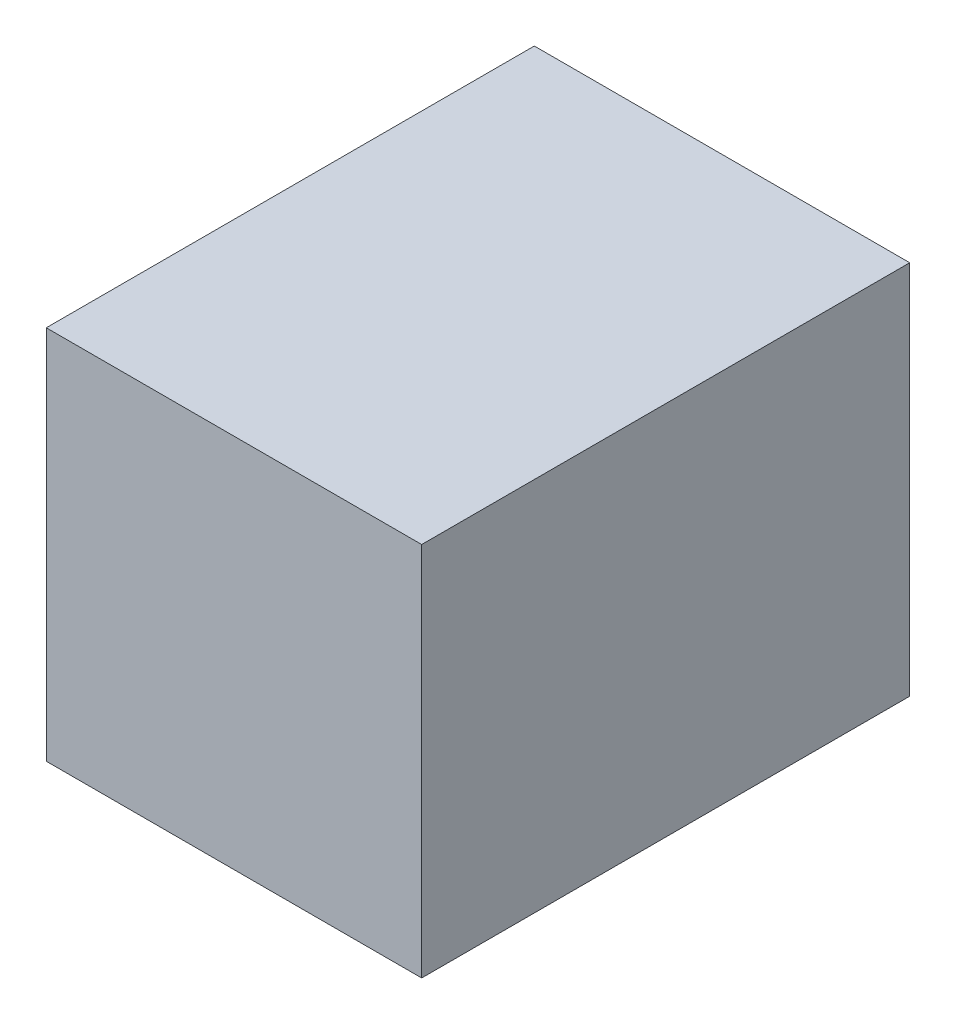
ISO-10303-21;
HEADER;
FILE_DESCRIPTION(('STEP AP214'),'2;1');
FILE_NAME('part.step','',(''),(''),'','','');
FILE_SCHEMA(('AUTOMOTIVE_DESIGN { 1 0 10303 214 1 1 1 1 }'));
ENDSEC;
DATA;
#1=APPLICATION_CONTEXT('core data for automotive mechanical design processes');
#2=APPLICATION_PROTOCOL_DEFINITION('international standard','automotive_design',2000,#1);
#3=PRODUCT_CONTEXT('',#1,'mechanical');
#4=PRODUCT('Part','Part','',(#3));
#5=PRODUCT_RELATED_PRODUCT_CATEGORY('part','',(#4));
#6=PRODUCT_DEFINITION_FORMATION('','',#4);
#7=PRODUCT_DEFINITION_CONTEXT('part definition',#1,'design');
#8=PRODUCT_DEFINITION('design','',#6,#7);
#9=PRODUCT_DEFINITION_SHAPE('','',#8);
#10=(LENGTH_UNIT() NAMED_UNIT(*) SI_UNIT(.MILLI.,.METRE.));
#11=(NAMED_UNIT(*) PLANE_ANGLE_UNIT() SI_UNIT($,.RADIAN.));
#12=(NAMED_UNIT(*) SI_UNIT($,.STERADIAN.) SOLID_ANGLE_UNIT());
#13=UNCERTAINTY_MEASURE_WITH_UNIT(LENGTH_MEASURE(1.E-05),#10,'distance_accuracy_value','');
#14=(GEOMETRIC_REPRESENTATION_CONTEXT(3) GLOBAL_UNCERTAINTY_ASSIGNED_CONTEXT((#13)) GLOBAL_UNIT_ASSIGNED_CONTEXT((#10,
#11,#12)) REPRESENTATION_CONTEXT('',''));
#15=CARTESIAN_POINT('',(0.,0.,0.));
#16=DIRECTION('',(0.,0.,1.));
#17=DIRECTION('',(1.,0.,0.));
#18=AXIS2_PLACEMENT_3D('',#15,#16,#17);
#19=CARTESIAN_POINT('',(5.,10.,6.5));
#20=DIRECTION('',(-1.,0.,0.));
#21=DIRECTION('',(0.,0.,1.));
#22=AXIS2_PLACEMENT_3D('',#19,#20,#21);
#23=PLANE('',#22);
#24=DIRECTION('',(0.,0.,-1.));
#25=VECTOR('',#24,1.);
#26=CARTESIAN_POINT('',(5.,0.,6.5));
#27=LINE('',#26,#25);
#28=CARTESIAN_POINT('',(5.,0.,6.5));
#29=VERTEX_POINT('',#28);
#30=CARTESIAN_POINT('',(5.,0.,-6.5));
#31=VERTEX_POINT('',#30);
#32=EDGE_CURVE('E184',#29,#31,#27,.T.);
#33=ORIENTED_EDGE('',*,*,#32,.T.);
#34=DIRECTION('',(0.,-1.,0.));
#35=VECTOR('',#34,1.);
#36=CARTESIAN_POINT('',(5.,10.,-6.5));
#37=LINE('',#36,#35);
#38=CARTESIAN_POINT('',(5.,10.,-6.5));
#39=VERTEX_POINT('',#38);
#40=EDGE_CURVE('E212',#39,#31,#37,.T.);
#41=ORIENTED_EDGE('',*,*,#40,.F.);
#42=DIRECTION('',(0.,0.,-1.));
#43=VECTOR('',#42,1.);
#44=CARTESIAN_POINT('',(5.,10.,6.5));
#45=LINE('',#44,#43);
#46=CARTESIAN_POINT('',(5.,10.,6.5));
#47=VERTEX_POINT('',#46);
#48=EDGE_CURVE('E186',#47,#39,#45,.T.);
#49=ORIENTED_EDGE('',*,*,#48,.F.);
#50=DIRECTION('',(0.,-1.,0.));
#51=VECTOR('',#50,1.);
#52=CARTESIAN_POINT('',(5.,10.,6.5));
#53=LINE('',#52,#51);
#54=EDGE_CURVE('E196',#47,#29,#53,.T.);
#55=ORIENTED_EDGE('',*,*,#54,.T.);
#56=EDGE_LOOP('',(#33,#41,#49,#55));
#57=FACE_BOUND('',#56,.T.);
#58=ADVANCED_FACE('F35',(#57),#23,.F.);
#59=CARTESIAN_POINT('',(-5.,10.,-6.5));
#60=DIRECTION('',(0.,0.,1.));
#61=DIRECTION('',(1.,0.,0.));
#62=AXIS2_PLACEMENT_3D('',#59,#60,#61);
#63=PLANE('',#62);
#64=DIRECTION('',(0.,1.,0.));
#65=VECTOR('',#64,1.);
#66=CARTESIAN_POINT('',(-0.499999999999999,1.4,-6.5));
#67=LINE('',#66,#65);
#68=CARTESIAN_POINT('',(-0.499999999999999,1.4,-6.5));
#69=VERTEX_POINT('',#68);
#70=CARTESIAN_POINT('',(-0.499999999999999,4.9,-6.5));
#71=VERTEX_POINT('',#70);
#72=EDGE_CURVE('E146',#69,#71,#67,.T.);
#73=ORIENTED_EDGE('',*,*,#72,.F.);
#74=DIRECTION('',(-1.,0.,0.));
#75=VECTOR('',#74,1.);
#76=CARTESIAN_POINT('',(2.5,1.4,-6.5));
#77=LINE('',#76,#75);
#78=CARTESIAN_POINT('',(2.5,1.4,-6.5));
#79=VERTEX_POINT('',#78);
#80=EDGE_CURVE('E156',#79,#69,#77,.T.);
#81=ORIENTED_EDGE('',*,*,#80,.F.);
#82=DIRECTION('',(0.,-1.,0.));
#83=VECTOR('',#82,1.);
#84=CARTESIAN_POINT('',(2.5,1.4,-6.5));
#85=LINE('',#84,#83);
#86=CARTESIAN_POINT('',(2.5,4.9,-6.5));
#87=VERTEX_POINT('',#86);
#88=EDGE_CURVE('E161',#87,#79,#85,.T.);
#89=ORIENTED_EDGE('',*,*,#88,.F.);
#90=CARTESIAN_POINT('',(1.,4.9,-6.5));
#91=DIRECTION('',(0.,0.,1.));
#92=DIRECTION('',(1.,0.,0.));
#93=AXIS2_PLACEMENT_3D('',#90,#91,#92);
#94=CIRCLE('',#93,1.5);
#95=CARTESIAN_POINT('',(1.,6.4,-6.5));
#96=VERTEX_POINT('',#95);
#97=EDGE_CURVE('E11',#87,#96,#94,.T.);
#98=ORIENTED_EDGE('',*,*,#97,.T.);
#99=CARTESIAN_POINT('',(1.,4.9,-6.5));
#100=DIRECTION('',(0.,0.,1.));
#101=DIRECTION('',(1.,0.,0.));
#102=AXIS2_PLACEMENT_3D('',#99,#100,#101);
#103=CIRCLE('',#102,1.5);
#104=EDGE_CURVE('E165',#96,#71,#103,.T.);
#105=ORIENTED_EDGE('',*,*,#104,.T.);
#106=EDGE_LOOP('',(#73,#81,#89,#98,#105));
#107=FACE_BOUND('',#106,.T.);
#108=DIRECTION('',(-1.,0.,0.));
#109=VECTOR('',#108,1.);
#110=CARTESIAN_POINT('',(-5.,0.,-6.5));
#111=LINE('',#110,#109);
#112=CARTESIAN_POINT('',(-5.,0.,-6.5));
#113=VERTEX_POINT('',#112);
#114=EDGE_CURVE('E199',#31,#113,#111,.T.);
#115=ORIENTED_EDGE('',*,*,#114,.T.);
#116=DIRECTION('',(0.,-1.,0.));
#117=VECTOR('',#116,1.);
#118=CARTESIAN_POINT('',(-5.,10.,-6.5));
#119=LINE('',#118,#117);
#120=CARTESIAN_POINT('',(-5.,10.,-6.5));
#121=VERTEX_POINT('',#120);
#122=EDGE_CURVE('E209',#121,#113,#119,.T.);
#123=ORIENTED_EDGE('',*,*,#122,.F.);
#124=DIRECTION('',(-1.,0.,0.));
#125=VECTOR('',#124,1.);
#126=CARTESIAN_POINT('',(-5.,10.,-6.5));
#127=LINE('',#126,#125);
#128=EDGE_CURVE('E189',#39,#121,#127,.T.);
#129=ORIENTED_EDGE('',*,*,#128,.F.);
#130=ORIENTED_EDGE('',*,*,#40,.T.);
#131=EDGE_LOOP('',(#115,#123,#129,#130));
#132=FACE_BOUND('',#131,.T.);
#133=ADVANCED_FACE('F163',(#107,#132),#63,.F.);
#134=CARTESIAN_POINT('',(-5.,10.,6.5));
#135=DIRECTION('',(1.,0.,0.));
#136=DIRECTION('',(0.,0.,-1.));
#137=AXIS2_PLACEMENT_3D('',#134,#135,#136);
#138=PLANE('',#137);
#139=DIRECTION('',(0.,0.,1.));
#140=VECTOR('',#139,1.);
#141=CARTESIAN_POINT('',(-5.,1.4,-4.25));
#142=LINE('',#141,#140);
#143=CARTESIAN_POINT('',(-5.,1.4,-4.25));
#144=VERTEX_POINT('',#143);
#145=CARTESIAN_POINT('',(-5.,1.4,4.25));
#146=VERTEX_POINT('',#145);
#147=EDGE_CURVE('E175',#144,#146,#142,.T.);
#148=ORIENTED_EDGE('',*,*,#147,.F.);
#149=DIRECTION('',(0.,-1.,0.));
#150=VECTOR('',#149,1.);
#151=CARTESIAN_POINT('',(-5.,1.4,-4.25));
#152=LINE('',#151,#150);
#153=CARTESIAN_POINT('',(-5.,3.4,-4.25));
#154=VERTEX_POINT('',#153);
#155=EDGE_CURVE('E170',#154,#144,#152,.T.);
#156=ORIENTED_EDGE('',*,*,#155,.F.);
#157=CARTESIAN_POINT('',(-5.,3.4,-1.25));
#158=DIRECTION('',(1.,0.,0.));
#159=DIRECTION('',(0.,0.,-1.));
#160=AXIS2_PLACEMENT_3D('',#157,#158,#159);
#161=CIRCLE('',#160,3.);
#162=CARTESIAN_POINT('',(-5.,6.4,-1.25));
#163=VERTEX_POINT('',#162);
#164=EDGE_CURVE('E226',#154,#163,#161,.T.);
#165=ORIENTED_EDGE('',*,*,#164,.T.);
#166=DIRECTION('',(0.,0.,-1.));
#167=VECTOR('',#166,1.);
#168=CARTESIAN_POINT('',(-5.,6.4,-4.25));
#169=LINE('',#168,#167);
#170=CARTESIAN_POINT('',(-5.,6.4,1.25));
#171=VERTEX_POINT('',#170);
#172=EDGE_CURVE('E173',#171,#163,#169,.T.);
#173=ORIENTED_EDGE('',*,*,#172,.F.);
#174=CARTESIAN_POINT('',(-5.,3.4,1.25));
#175=DIRECTION('',(1.,0.,0.));
#176=DIRECTION('',(0.,0.,-1.));
#177=AXIS2_PLACEMENT_3D('',#174,#175,#176);
#178=CIRCLE('',#177,3.);
#179=CARTESIAN_POINT('',(-5.,3.4,4.25));
#180=VERTEX_POINT('',#179);
#181=EDGE_CURVE('E224',#171,#180,#178,.T.);
#182=ORIENTED_EDGE('',*,*,#181,.T.);
#183=DIRECTION('',(0.,1.,0.));
#184=VECTOR('',#183,1.);
#185=CARTESIAN_POINT('',(-5.,1.4,4.25));
#186=LINE('',#185,#184);
#187=EDGE_CURVE('E178',#146,#180,#186,.T.);
#188=ORIENTED_EDGE('',*,*,#187,.F.);
#189=EDGE_LOOP('',(#148,#156,#165,#173,#182,#188));
#190=FACE_BOUND('',#189,.T.);
#191=DIRECTION('',(0.,0.,1.));
#192=VECTOR('',#191,1.);
#193=CARTESIAN_POINT('',(-5.,0.,6.5));
#194=LINE('',#193,#192);
#195=CARTESIAN_POINT('',(-5.,0.,6.5));
#196=VERTEX_POINT('',#195);
#197=EDGE_CURVE('E201',#113,#196,#194,.T.);
#198=ORIENTED_EDGE('',*,*,#197,.T.);
#199=DIRECTION('',(0.,-1.,0.));
#200=VECTOR('',#199,1.);
#201=CARTESIAN_POINT('',(-5.,10.,6.5));
#202=LINE('',#201,#200);
#203=CARTESIAN_POINT('',(-5.,10.,6.5));
#204=VERTEX_POINT('',#203);
#205=EDGE_CURVE('E206',#204,#196,#202,.T.);
#206=ORIENTED_EDGE('',*,*,#205,.F.);
#207=DIRECTION('',(0.,0.,1.));
#208=VECTOR('',#207,1.);
#209=CARTESIAN_POINT('',(-5.,10.,6.5));
#210=LINE('',#209,#208);
#211=EDGE_CURVE('E192',#121,#204,#210,.T.);
#212=ORIENTED_EDGE('',*,*,#211,.F.);
#213=ORIENTED_EDGE('',*,*,#122,.T.);
#214=EDGE_LOOP('',(#198,#206,#212,#213));
#215=FACE_BOUND('',#214,.T.);
#216=ADVANCED_FACE('F281',(#190,#215),#138,.F.);
#217=CARTESIAN_POINT('',(-5.,10.,6.5));
#218=DIRECTION('',(0.,0.,-1.));
#219=DIRECTION('',(-1.,0.,0.));
#220=AXIS2_PLACEMENT_3D('',#217,#218,#219);
#221=PLANE('',#220);
#222=DIRECTION('',(1.,0.,0.));
#223=VECTOR('',#222,1.);
#224=CARTESIAN_POINT('',(-5.,0.,6.5));
#225=LINE('',#224,#223);
#226=EDGE_CURVE('E190',#196,#29,#225,.T.);
#227=ORIENTED_EDGE('',*,*,#226,.T.);
#228=ORIENTED_EDGE('',*,*,#54,.F.);
#229=DIRECTION('',(1.,0.,0.));
#230=VECTOR('',#229,1.);
#231=CARTESIAN_POINT('',(-5.,10.,6.5));
#232=LINE('',#231,#230);
#233=EDGE_CURVE('E194',#204,#47,#232,.T.);
#234=ORIENTED_EDGE('',*,*,#233,.F.);
#235=ORIENTED_EDGE('',*,*,#205,.T.);
#236=EDGE_LOOP('',(#227,#228,#234,#235));
#237=FACE_BOUND('',#236,.T.);
#238=ADVANCED_FACE('F286',(#237),#221,.F.);
#239=CARTESIAN_POINT('',(0.,10.,0.));
#240=DIRECTION('',(0.,-1.,0.));
#241=DIRECTION('',(0.,0.,-1.));
#242=AXIS2_PLACEMENT_3D('',#239,#240,#241);
#243=PLANE('',#242);
#244=ORIENTED_EDGE('',*,*,#48,.T.);
#245=ORIENTED_EDGE('',*,*,#128,.T.);
#246=ORIENTED_EDGE('',*,*,#211,.T.);
#247=ORIENTED_EDGE('',*,*,#233,.T.);
#248=EDGE_LOOP('',(#244,#245,#246,#247));
#249=FACE_BOUND('',#248,.T.);
#250=ADVANCED_FACE('F290',(#249),#243,.F.);
#251=CARTESIAN_POINT('',(0.,0.,0.));
#252=DIRECTION('',(0.,-1.,0.));
#253=DIRECTION('',(0.,0.,-1.));
#254=AXIS2_PLACEMENT_3D('',#251,#252,#253);
#255=PLANE('',#254);
#256=ORIENTED_EDGE('',*,*,#32,.F.);
#257=ORIENTED_EDGE('',*,*,#226,.F.);
#258=ORIENTED_EDGE('',*,*,#197,.F.);
#259=ORIENTED_EDGE('',*,*,#114,.F.);
#260=EDGE_LOOP('',(#256,#257,#258,#259));
#261=FACE_BOUND('',#260,.T.);
#262=ADVANCED_FACE('F292',(#261),#255,.T.);
#263=CARTESIAN_POINT('',(2.5,1.4,-4.25));
#264=DIRECTION('',(0.,0.,-1.));
#265=DIRECTION('',(-1.,0.,0.));
#266=AXIS2_PLACEMENT_3D('',#263,#264,#265);
#267=PLANE('',#266);
#268=DIRECTION('',(0.,1.,0.));
#269=VECTOR('',#268,1.);
#270=CARTESIAN_POINT('',(-0.499999999999999,1.4,-4.25));
#271=LINE('',#270,#269);
#272=CARTESIAN_POINT('',(-0.499999999999999,1.4,-4.25));
#273=VERTEX_POINT('',#272);
#274=CARTESIAN_POINT('',(-0.499999999999999,3.4,-4.25));
#275=VERTEX_POINT('',#274);
#276=EDGE_CURVE('E149',#273,#275,#271,.T.);
#277=ORIENTED_EDGE('',*,*,#276,.T.);
#278=DIRECTION('',(-1.,0.,0.));
#279=VECTOR('',#278,1.);
#280=CARTESIAN_POINT('',(-5.,3.4,-4.25));
#281=LINE('',#280,#279);
#282=EDGE_CURVE('E221',#275,#154,#281,.T.);
#283=ORIENTED_EDGE('',*,*,#282,.T.);
#284=ORIENTED_EDGE('',*,*,#155,.T.);
#285=DIRECTION('',(-1.,0.,0.));
#286=VECTOR('',#285,1.);
#287=CARTESIAN_POINT('',(2.5,1.4,-4.25));
#288=LINE('',#287,#286);
#289=EDGE_CURVE('E172',#273,#144,#288,.T.);
#290=ORIENTED_EDGE('',*,*,#289,.F.);
#291=EDGE_LOOP('',(#277,#283,#284,#290));
#292=FACE_BOUND('',#291,.T.);
#293=ADVANCED_FACE('F295',(#292),#267,.F.);
#294=CARTESIAN_POINT('',(2.5,6.4,-4.25));
#295=DIRECTION('',(0.,1.,0.));
#296=DIRECTION('',(0.,0.,1.));
#297=AXIS2_PLACEMENT_3D('',#294,#295,#296);
#298=PLANE('',#297);
#299=DIRECTION('',(-1.,0.,0.));
#300=VECTOR('',#299,1.);
#301=CARTESIAN_POINT('',(-0.499999999999999,6.4,-1.25));
#302=LINE('',#301,#300);
#303=CARTESIAN_POINT('',(1.,6.4,-1.25));
#304=VERTEX_POINT('',#303);
#305=EDGE_CURVE('E59',#163,#304,#302,.F.);
#306=ORIENTED_EDGE('',*,*,#305,.T.);
#307=DIRECTION('',(0.,0.,-1.));
#308=VECTOR('',#307,1.);
#309=CARTESIAN_POINT('',(1.,6.4,1.25));
#310=LINE('',#309,#308);
#311=CARTESIAN_POINT('',(1.,6.4,1.25));
#312=VERTEX_POINT('',#311);
#313=EDGE_CURVE('E245',#304,#312,#310,.F.);
#314=ORIENTED_EDGE('',*,*,#313,.T.);
#315=DIRECTION('',(-1.,0.,0.));
#316=VECTOR('',#315,1.);
#317=CARTESIAN_POINT('',(-5.,6.4,1.25));
#318=LINE('',#317,#316);
#319=EDGE_CURVE('E216',#312,#171,#318,.T.);
#320=ORIENTED_EDGE('',*,*,#319,.T.);
#321=ORIENTED_EDGE('',*,*,#172,.T.);
#322=EDGE_LOOP('',(#306,#314,#320,#321));
#323=FACE_BOUND('',#322,.T.);
#324=ADVANCED_FACE('F302',(#323),#298,.F.);
#325=CARTESIAN_POINT('',(2.5,1.4,4.25));
#326=DIRECTION('',(0.,0.,1.));
#327=DIRECTION('',(1.,0.,0.));
#328=AXIS2_PLACEMENT_3D('',#325,#326,#327);
#329=PLANE('',#328);
#330=DIRECTION('',(-1.,0.,0.));
#331=VECTOR('',#330,1.);
#332=CARTESIAN_POINT('',(2.5,3.4,4.25));
#333=LINE('',#332,#331);
#334=CARTESIAN_POINT('',(1.,3.4,4.25));
#335=VERTEX_POINT('',#334);
#336=EDGE_CURVE('E218',#180,#335,#333,.F.);
#337=ORIENTED_EDGE('',*,*,#336,.T.);
#338=DIRECTION('',(0.,1.,0.));
#339=VECTOR('',#338,1.);
#340=CARTESIAN_POINT('',(1.,1.4,4.25));
#341=LINE('',#340,#339);
#342=CARTESIAN_POINT('',(1.,1.4,4.25));
#343=VERTEX_POINT('',#342);
#344=EDGE_CURVE('E237',#335,#343,#341,.F.);
#345=ORIENTED_EDGE('',*,*,#344,.T.);
#346=DIRECTION('',(-1.,0.,0.));
#347=VECTOR('',#346,1.);
#348=CARTESIAN_POINT('',(2.5,1.4,4.25));
#349=LINE('',#348,#347);
#350=EDGE_CURVE('E182',#343,#146,#349,.T.);
#351=ORIENTED_EDGE('',*,*,#350,.T.);
#352=ORIENTED_EDGE('',*,*,#187,.T.);
#353=EDGE_LOOP('',(#337,#345,#351,#352));
#354=FACE_BOUND('',#353,.T.);
#355=ADVANCED_FACE('F307',(#354),#329,.F.);
#356=CARTESIAN_POINT('',(2.5,1.4,-4.25));
#357=DIRECTION('',(0.,-1.,0.));
#358=DIRECTION('',(0.,0.,-1.));
#359=AXIS2_PLACEMENT_3D('',#356,#357,#358);
#360=PLANE('',#359);
#361=ORIENTED_EDGE('',*,*,#350,.F.);
#362=CARTESIAN_POINT('',(1.,1.4,2.75));
#363=DIRECTION('',(0.,-1.,0.));
#364=DIRECTION('',(0.,0.,-1.));
#365=AXIS2_PLACEMENT_3D('',#362,#363,#364);
#366=CIRCLE('',#365,1.5);
#367=CARTESIAN_POINT('',(2.5,1.4,2.75));
#368=VERTEX_POINT('',#367);
#369=EDGE_CURVE('E239',#343,#368,#366,.F.);
#370=ORIENTED_EDGE('',*,*,#369,.T.);
#371=DIRECTION('',(0.,0.,1.));
#372=VECTOR('',#371,1.);
#373=CARTESIAN_POINT('',(2.5,1.4,-4.25));
#374=LINE('',#373,#372);
#375=EDGE_CURVE('E160',#79,#368,#374,.T.);
#376=ORIENTED_EDGE('',*,*,#375,.F.);
#377=ORIENTED_EDGE('',*,*,#80,.T.);
#378=DIRECTION('',(0.,0.,-1.));
#379=VECTOR('',#378,1.);
#380=CARTESIAN_POINT('',(-0.499999999999999,1.4,10.0809518948453));
#381=LINE('',#380,#379);
#382=EDGE_CURVE('E142',#273,#69,#381,.T.);
#383=ORIENTED_EDGE('',*,*,#382,.F.);
#384=ORIENTED_EDGE('',*,*,#289,.T.);
#385=ORIENTED_EDGE('',*,*,#147,.T.);
#386=EDGE_LOOP('',(#361,#370,#376,#377,#383,#384,#385));
#387=FACE_BOUND('',#386,.T.);
#388=ADVANCED_FACE('F158',(#387),#360,.F.);
#389=CARTESIAN_POINT('',(2.5,0.,0.));
#390=DIRECTION('',(1.,0.,0.));
#391=DIRECTION('',(0.,0.,-1.));
#392=AXIS2_PLACEMENT_3D('',#389,#390,#391);
#393=PLANE('',#392);
#394=ORIENTED_EDGE('',*,*,#375,.T.);
#395=DIRECTION('',(0.,1.,0.));
#396=VECTOR('',#395,1.);
#397=CARTESIAN_POINT('',(2.5,3.4,2.75));
#398=LINE('',#397,#396);
#399=CARTESIAN_POINT('',(2.5,3.4,2.75));
#400=VERTEX_POINT('',#399);
#401=EDGE_CURVE('E234',#368,#400,#398,.T.);
#402=ORIENTED_EDGE('',*,*,#401,.T.);
#403=CARTESIAN_POINT('',(2.5,3.4,1.25));
#404=DIRECTION('',(1.,0.,0.));
#405=DIRECTION('',(0.,0.,-1.));
#406=AXIS2_PLACEMENT_3D('',#403,#404,#405);
#407=CIRCLE('',#406,1.5);
#408=CARTESIAN_POINT('',(2.5,4.9,1.25));
#409=VERTEX_POINT('',#408);
#410=EDGE_CURVE('E232',#400,#409,#407,.F.);
#411=ORIENTED_EDGE('',*,*,#410,.T.);
#412=DIRECTION('',(0.,0.,-1.));
#413=VECTOR('',#412,1.);
#414=CARTESIAN_POINT('',(2.5,4.9,-6.5));
#415=LINE('',#414,#413);
#416=EDGE_CURVE('E230',#409,#87,#415,.T.);
#417=ORIENTED_EDGE('',*,*,#416,.T.);
#418=ORIENTED_EDGE('',*,*,#88,.T.);
#419=EDGE_LOOP('',(#394,#402,#411,#417,#418));
#420=FACE_BOUND('',#419,.T.);
#421=ADVANCED_FACE('F306',(#420),#393,.F.);
#422=CARTESIAN_POINT('',(-0.499999999999999,1.4,10.0809518948453));
#423=DIRECTION('',(-1.,0.,0.));
#424=DIRECTION('',(0.,0.,1.));
#425=AXIS2_PLACEMENT_3D('',#422,#423,#424);
#426=PLANE('',#425);
#427=ORIENTED_EDGE('',*,*,#72,.T.);
#428=DIRECTION('',(0.,0.,-1.));
#429=VECTOR('',#428,1.);
#430=CARTESIAN_POINT('',(-0.499999999999999,4.9,-1.25));
#431=LINE('',#430,#429);
#432=CARTESIAN_POINT('',(-0.499999999999999,4.9,-3.84807621135332));
#433=VERTEX_POINT('',#432);
#434=EDGE_CURVE('E243',#71,#433,#431,.F.);
#435=ORIENTED_EDGE('',*,*,#434,.T.);
#436=CARTESIAN_POINT('',(-0.499999999999999,3.4,-1.25));
#437=DIRECTION('',(-1.,0.,0.));
#438=DIRECTION('',(0.,0.,1.));
#439=AXIS2_PLACEMENT_3D('',#436,#437,#438);
#440=CIRCLE('',#439,3.);
#441=EDGE_CURVE('E228',#433,#275,#440,.T.);
#442=ORIENTED_EDGE('',*,*,#441,.T.);
#443=ORIENTED_EDGE('',*,*,#276,.F.);
#444=ORIENTED_EDGE('',*,*,#382,.T.);
#445=EDGE_LOOP('',(#427,#435,#442,#443,#444));
#446=FACE_BOUND('',#445,.T.);
#447=ADVANCED_FACE('F144',(#446),#426,.F.);
#448=CARTESIAN_POINT('',(2.5,3.4,1.25));
#449=DIRECTION('',(1.,0.,0.));
#450=DIRECTION('',(0.,0.,-1.));
#451=AXIS2_PLACEMENT_3D('',#448,#449,#450);
#452=CYLINDRICAL_SURFACE('',#451,3.);
#453=ORIENTED_EDGE('',*,*,#319,.F.);
#454=CARTESIAN_POINT('',(1.,3.4,1.25));
#455=DIRECTION('',(1.,0.,0.));
#456=DIRECTION('',(0.,0.,-1.));
#457=AXIS2_PLACEMENT_3D('',#454,#455,#456);
#458=CIRCLE('',#457,3.);
#459=EDGE_CURVE('E241',#312,#335,#458,.T.);
#460=ORIENTED_EDGE('',*,*,#459,.T.);
#461=ORIENTED_EDGE('',*,*,#336,.F.);
#462=ORIENTED_EDGE('',*,*,#181,.F.);
#463=EDGE_LOOP('',(#453,#460,#461,#462));
#464=FACE_BOUND('',#463,.T.);
#465=ADVANCED_FACE('F259',(#464),#452,.F.);
#466=CARTESIAN_POINT('',(2.5,3.4,-1.25));
#467=DIRECTION('',(1.,0.,0.));
#468=DIRECTION('',(0.,0.,-1.));
#469=AXIS2_PLACEMENT_3D('',#466,#467,#468);
#470=CYLINDRICAL_SURFACE('',#469,3.);
#471=ORIENTED_EDGE('',*,*,#441,.F.);
#472=CARTESIAN_POINT('',(-0.499999999999999,4.9,-3.84807621135332));
#473=CARTESIAN_POINT('',(-0.500000315907656,4.95618927854444,-3.81565828796528));
#474=CARTESIAN_POINT('',(-0.496845217990448,5.01124116621213,-3.78142261664956));
#475=CARTESIAN_POINT('',(-0.484979889079344,5.1184845812889,-3.70986245212497));
#476=CARTESIAN_POINT('',(-0.476283735109402,5.17068299411305,-3.6725459941458));
#477=CARTESIAN_POINT('',(-0.454231513679554,5.27125218825883,-3.59571454410148));
#478=CARTESIAN_POINT('',(-0.440938704238222,5.31966451533886,-3.55623522580162));
#479=CARTESIAN_POINT('',(-0.410322108307569,5.41324050696073,-3.47501825325649));
#480=CARTESIAN_POINT('',(-0.392995351139573,5.45840174509148,-3.43327895218459));
#481=CARTESIAN_POINT('',(-0.328651555420402,5.60529614888204,-3.28903147147546));
#482=CARTESIAN_POINT('',(-0.273622181592244,5.69923184431885,-3.18203997695864));
#483=CARTESIAN_POINT('',(-0.150213863518946,5.86854062415176,-2.9605342835554));
#484=CARTESIAN_POINT('',(-0.0817561003700234,5.9437978605184,-2.84597845497009));
#485=CARTESIAN_POINT('',(0.0423229722545172,6.05656071669525,-2.64699201775638));
#486=CARTESIAN_POINT('',(0.095723814335842,6.09864162163063,-2.56371131179592));
#487=CARTESIAN_POINT('',(0.205808445936071,6.17425290463135,-2.39544006759218));
#488=CARTESIAN_POINT('',(0.262493417925649,6.20778017913661,-2.31044892077349));
#489=CARTESIAN_POINT('',(0.435865020612881,6.29590755052714,-2.05398061614075));
#490=CARTESIAN_POINT('',(0.556124952205536,6.33827464988021,-1.88060702728109));
#491=CARTESIAN_POINT('',(0.782513198510445,6.38797593005562,-1.5575994564991));
#492=CARTESIAN_POINT('',(0.888122418072181,6.3995420396998,-1.40821929044816));
#493=CARTESIAN_POINT('',(0.99578365871876,6.39999554716077,-1.2559628058114));
#494=CARTESIAN_POINT('',(0.997891846319717,6.39999999110445,-1.25298137881002));
#495=CARTESIAN_POINT('',(1.,6.4,-1.25));
#496=B_SPLINE_CURVE_WITH_KNOTS('',3,(#472,#473,#474,#475,#476,#477,#478,#479,#480,#481,#482,
#483,#484,#485,#486,#487,#488,#489,#490,#491,#492,#493,#494,#495),.UNSPECIFIED.,.F.,.F.,(4,2,2,
2,2,2,2,2,2,2,2,4),(0.,0.194388358986715,0.388284833714312,0.579612677891838,0.77108186784912,
1.22638892843809,1.68445304552812,2.00656593965091,2.32879554205455,2.97169735448902,
3.52016091646008,3.53111537572837),.UNSPECIFIED.);
#497=EDGE_CURVE('E45',#433,#304,#496,.T.);
#498=ORIENTED_EDGE('',*,*,#497,.T.);
#499=ORIENTED_EDGE('',*,*,#305,.F.);
#500=ORIENTED_EDGE('',*,*,#164,.F.);
#501=ORIENTED_EDGE('',*,*,#282,.F.);
#502=EDGE_LOOP('',(#471,#498,#499,#500,#501));
#503=FACE_BOUND('',#502,.T.);
#504=ADVANCED_FACE('F254',(#503),#470,.F.);
#505=CARTESIAN_POINT('',(1.,4.9,-4.25));
#506=DIRECTION('',(0.,0.,1.));
#507=DIRECTION('',(1.,0.,0.));
#508=AXIS2_PLACEMENT_3D('',#505,#506,#507);
#509=CYLINDRICAL_SURFACE('',#508,1.5);
#510=ORIENTED_EDGE('',*,*,#434,.F.);
#511=ORIENTED_EDGE('',*,*,#104,.F.);
#512=DIRECTION('',(0.,0.,-1.));
#513=VECTOR('',#512,1.);
#514=CARTESIAN_POINT('',(1.,6.4,-6.5));
#515=LINE('',#514,#513);
#516=EDGE_CURVE('E40',#304,#96,#515,.T.);
#517=ORIENTED_EDGE('',*,*,#516,.F.);
#518=ORIENTED_EDGE('',*,*,#497,.F.);
#519=EDGE_LOOP('',(#510,#511,#517,#518));
#520=FACE_BOUND('',#519,.T.);
#521=ADVANCED_FACE('F37',(#520),#509,.F.);
#522=CARTESIAN_POINT('',(1.,4.9,0.));
#523=DIRECTION('',(0.,0.,1.));
#524=DIRECTION('',(1.,0.,0.));
#525=AXIS2_PLACEMENT_3D('',#522,#523,#524);
#526=CYLINDRICAL_SURFACE('',#525,1.5);
#527=ORIENTED_EDGE('',*,*,#97,.F.);
#528=ORIENTED_EDGE('',*,*,#416,.F.);
#529=CARTESIAN_POINT('',(1.,4.9,1.25));
#530=DIRECTION('',(0.,0.,-1.));
#531=DIRECTION('',(-1.,0.,0.));
#532=AXIS2_PLACEMENT_3D('',#529,#530,#531);
#533=CIRCLE('',#532,1.5);
#534=EDGE_CURVE('E332',#312,#409,#533,.T.);
#535=ORIENTED_EDGE('',*,*,#534,.F.);
#536=ORIENTED_EDGE('',*,*,#313,.F.);
#537=ORIENTED_EDGE('',*,*,#516,.T.);
#538=EDGE_LOOP('',(#527,#528,#535,#536,#537));
#539=FACE_BOUND('',#538,.T.);
#540=ADVANCED_FACE('F268',(#539),#526,.F.);
#541=CARTESIAN_POINT('',(1.,3.4,1.25));
#542=DIRECTION('',(1.,0.,0.));
#543=DIRECTION('',(0.,0.,-1.));
#544=AXIS2_PLACEMENT_3D('',#541,#542,#543);
#545=DEGENERATE_TOROIDAL_SURFACE('',#544,1.5,1.5,.T.);
#546=ORIENTED_EDGE('',*,*,#534,.T.);
#547=ORIENTED_EDGE('',*,*,#410,.F.);
#548=CARTESIAN_POINT('',(1.,3.4,2.75));
#549=DIRECTION('',(0.,1.,0.));
#550=DIRECTION('',(0.,0.,1.));
#551=AXIS2_PLACEMENT_3D('',#548,#549,#550);
#552=CIRCLE('',#551,1.5);
#553=EDGE_CURVE('E335',#335,#400,#552,.T.);
#554=ORIENTED_EDGE('',*,*,#553,.F.);
#555=ORIENTED_EDGE('',*,*,#459,.F.);
#556=EDGE_LOOP('',(#546,#547,#554,#555));
#557=FACE_BOUND('',#556,.T.);
#558=ADVANCED_FACE('F265',(#557),#545,.F.);
#559=CARTESIAN_POINT('',(1.,0.,2.75));
#560=DIRECTION('',(0.,-1.,0.));
#561=DIRECTION('',(0.,0.,-1.));
#562=AXIS2_PLACEMENT_3D('',#559,#560,#561);
#563=CYLINDRICAL_SURFACE('',#562,1.5);
#564=ORIENTED_EDGE('',*,*,#369,.F.);
#565=ORIENTED_EDGE('',*,*,#344,.F.);
#566=ORIENTED_EDGE('',*,*,#553,.T.);
#567=ORIENTED_EDGE('',*,*,#401,.F.);
#568=EDGE_LOOP('',(#564,#565,#566,#567));
#569=FACE_BOUND('',#568,.T.);
#570=ADVANCED_FACE('F262',(#569),#563,.F.);
#571=CLOSED_SHELL('',(#58,#133,#216,#238,#250,#262,#293,#324,#355,#388,#421,#447,#465,#504,#521,
#540,#558,#570));
#572=MANIFOLD_SOLID_BREP('B2',#571);
#573=ADVANCED_BREP_SHAPE_REPRESENTATION('',(#18,#572),#14);
#574=SHAPE_DEFINITION_REPRESENTATION(#9,#573);
ENDSEC;
END-ISO-10303-21;
